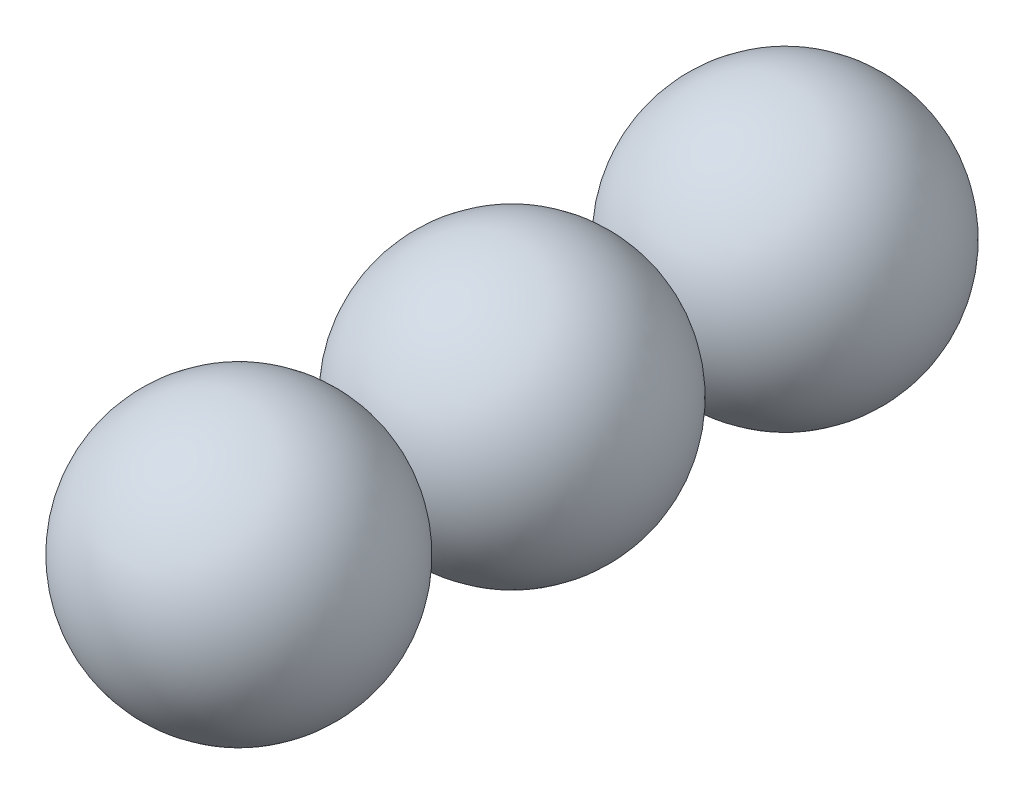
ISO-10303-21;
HEADER;
FILE_DESCRIPTION(('STEP AP214'),'2;1');
FILE_NAME('part.step','',(''),(''),'','','');
FILE_SCHEMA(('AUTOMOTIVE_DESIGN { 1 0 10303 214 1 1 1 1 }'));
ENDSEC;
DATA;
#1=APPLICATION_CONTEXT('core data for automotive mechanical design processes');
#2=APPLICATION_PROTOCOL_DEFINITION('international standard','automotive_design',2000,#1);
#3=PRODUCT_CONTEXT('',#1,'mechanical');
#4=PRODUCT('Part','Part','',(#3));
#5=PRODUCT_RELATED_PRODUCT_CATEGORY('part','',(#4));
#6=PRODUCT_DEFINITION_FORMATION('','',#4);
#7=PRODUCT_DEFINITION_CONTEXT('part definition',#1,'design');
#8=PRODUCT_DEFINITION('design','',#6,#7);
#9=PRODUCT_DEFINITION_SHAPE('','',#8);
#10=(LENGTH_UNIT() NAMED_UNIT(*) SI_UNIT(.MILLI.,.METRE.));
#11=(NAMED_UNIT(*) PLANE_ANGLE_UNIT() SI_UNIT($,.RADIAN.));
#12=(NAMED_UNIT(*) SI_UNIT($,.STERADIAN.) SOLID_ANGLE_UNIT());
#13=UNCERTAINTY_MEASURE_WITH_UNIT(LENGTH_MEASURE(1.E-05),#10,'distance_accuracy_value','');
#14=(GEOMETRIC_REPRESENTATION_CONTEXT(3) GLOBAL_UNCERTAINTY_ASSIGNED_CONTEXT((#13)) GLOBAL_UNIT_ASSIGNED_CONTEXT((#10,
#11,#12)) REPRESENTATION_CONTEXT('',''));
#15=CARTESIAN_POINT('',(0.,0.,0.));
#16=DIRECTION('',(0.,0.,1.));
#17=DIRECTION('',(1.,0.,0.));
#18=AXIS2_PLACEMENT_3D('',#15,#16,#17);
#19=CARTESIAN_POINT('',(0.,0.,120.));
#20=DIRECTION('',(0.,1.,0.));
#21=DIRECTION('',(1.,0.,0.));
#22=AXIS2_PLACEMENT_3D('',#19,#20,#21);
#23=SPHERICAL_SURFACE('',#22,30.);
#24=CARTESIAN_POINT('',(0.,30.,120.));
#25=VERTEX_POINT('',#24);
#26=VERTEX_LOOP('',#25);
#27=FACE_BOUND('',#26,.T.);
#28=ADVANCED_FACE('F41',(#27),#23,.T.);
#29=CLOSED_SHELL('',(#28));
#30=MANIFOLD_SOLID_BREP('B2',#29);
#31=CARTESIAN_POINT('',(0.,0.,60.));
#32=DIRECTION('',(0.,1.,0.));
#33=DIRECTION('',(1.,0.,0.));
#34=AXIS2_PLACEMENT_3D('',#31,#32,#33);
#35=SPHERICAL_SURFACE('',#34,30.);
#36=CARTESIAN_POINT('',(0.,30.,60.));
#37=VERTEX_POINT('',#36);
#38=VERTEX_LOOP('',#37);
#39=FACE_BOUND('',#38,.T.);
#40=ADVANCED_FACE('F58',(#39),#35,.T.);
#41=CLOSED_SHELL('',(#40));
#42=MANIFOLD_SOLID_BREP('B6',#41);
#43=CARTESIAN_POINT('',(0.,0.,0.));
#44=DIRECTION('',(0.,1.,0.));
#45=DIRECTION('',(1.,0.,0.));
#46=AXIS2_PLACEMENT_3D('',#43,#44,#45);
#47=SPHERICAL_SURFACE('',#46,30.);
#48=CARTESIAN_POINT('',(0.,30.,0.));
#49=VERTEX_POINT('',#48);
#50=VERTEX_LOOP('',#49);
#51=FACE_BOUND('',#50,.T.);
#52=ADVANCED_FACE('F70',(#51),#47,.T.);
#53=CLOSED_SHELL('',(#52));
#54=MANIFOLD_SOLID_BREP('B37',#53);
#55=ADVANCED_BREP_SHAPE_REPRESENTATION('',(#18,#30,#42,#54),#14);
#56=SHAPE_DEFINITION_REPRESENTATION(#9,#55);
ENDSEC;
END-ISO-10303-21;
